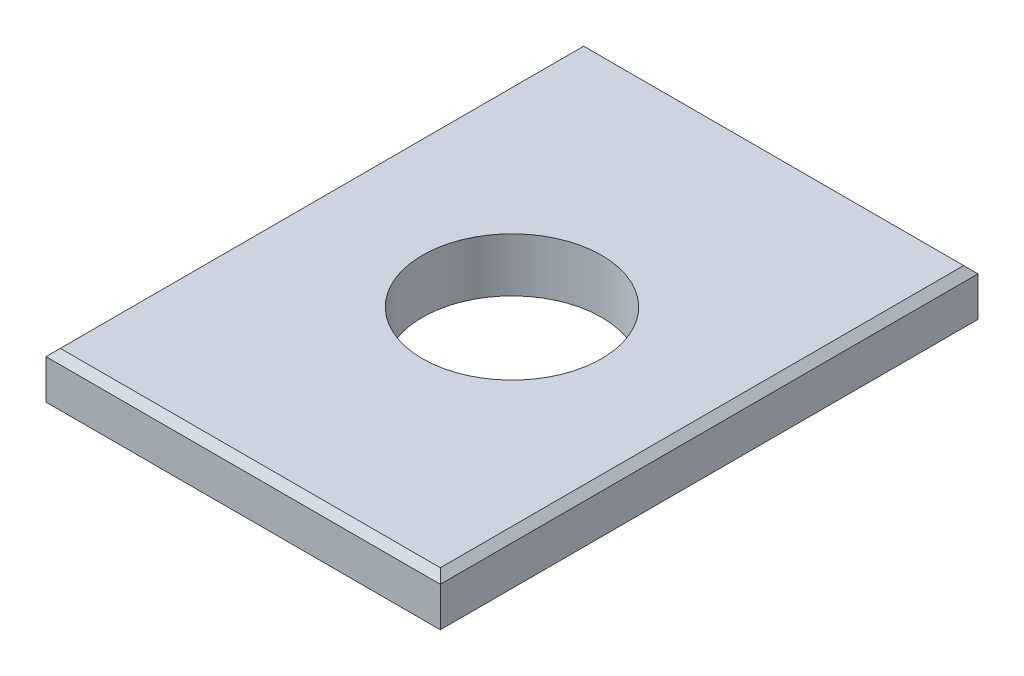
ISO-10303-21;
HEADER;
FILE_DESCRIPTION(('STEP AP214'),'2;1');
FILE_NAME('part.step','',(''),(''),'','','');
FILE_SCHEMA(('AUTOMOTIVE_DESIGN { 1 0 10303 214 1 1 1 1 }'));
ENDSEC;
DATA;
#1=APPLICATION_CONTEXT('core data for automotive mechanical design processes');
#2=APPLICATION_PROTOCOL_DEFINITION('international standard','automotive_design',2000,#1);
#3=PRODUCT_CONTEXT('',#1,'mechanical');
#4=PRODUCT('Part','Part','',(#3));
#5=PRODUCT_RELATED_PRODUCT_CATEGORY('part','',(#4));
#6=PRODUCT_DEFINITION_FORMATION('','',#4);
#7=PRODUCT_DEFINITION_CONTEXT('part definition',#1,'design');
#8=PRODUCT_DEFINITION('design','',#6,#7);
#9=PRODUCT_DEFINITION_SHAPE('','',#8);
#10=(LENGTH_UNIT() NAMED_UNIT(*) SI_UNIT(.MILLI.,.METRE.));
#11=(NAMED_UNIT(*) PLANE_ANGLE_UNIT() SI_UNIT($,.RADIAN.));
#12=(NAMED_UNIT(*) SI_UNIT($,.STERADIAN.) SOLID_ANGLE_UNIT());
#13=UNCERTAINTY_MEASURE_WITH_UNIT(LENGTH_MEASURE(1.E-05),#10,'distance_accuracy_value','');
#14=(GEOMETRIC_REPRESENTATION_CONTEXT(3) GLOBAL_UNCERTAINTY_ASSIGNED_CONTEXT((#13)) GLOBAL_UNIT_ASSIGNED_CONTEXT((#10,
#11,#12)) REPRESENTATION_CONTEXT('',''));
#15=CARTESIAN_POINT('',(0.,0.,0.));
#16=DIRECTION('',(0.,0.,1.));
#17=DIRECTION('',(1.,0.,0.));
#18=AXIS2_PLACEMENT_3D('',#15,#16,#17);
#19=CARTESIAN_POINT('',(5.49999999999962,1.50000000000022,-7.50000000000011));
#20=DIRECTION('',(-0.999999999999998,0.,0.));
#21=DIRECTION('',(0.,0.,1.));
#22=AXIS2_PLACEMENT_3D('',#19,#20,#21);
#23=PLANE('',#22);
#24=DIRECTION('',(0.,-0.999999999999995,0.));
#25=VECTOR('',#24,1.);
#26=CARTESIAN_POINT('',(5.49999999999934,1.50000000000022,7.49999999999917));
#27=LINE('',#26,#25);
#28=CARTESIAN_POINT('',(5.49999999999995,1.30000000000025,7.49999999999917));
#29=VERTEX_POINT('',#28);
#30=CARTESIAN_POINT('',(5.49999999999973,0.2000000000002,7.49999999999906));
#31=VERTEX_POINT('',#30);
#32=EDGE_CURVE('E191',#29,#31,#27,.T.);
#33=ORIENTED_EDGE('',*,*,#32,.T.);
#34=DIRECTION('',(0.,0.,-1.));
#35=VECTOR('',#34,1.);
#36=CARTESIAN_POINT('',(5.49999999999978,0.2000000000002,-7.50000000000012));
#37=LINE('',#36,#35);
#38=CARTESIAN_POINT('',(5.49999999999978,0.2000000000002,-7.50000000000012));
#39=VERTEX_POINT('',#38);
#40=EDGE_CURVE('E59',#31,#39,#37,.T.);
#41=ORIENTED_EDGE('',*,*,#40,.T.);
#42=DIRECTION('',(0.,-0.999999999999995,0.));
#43=VECTOR('',#42,1.);
#44=CARTESIAN_POINT('',(5.49999999999962,1.50000000000022,-7.50000000000011));
#45=LINE('',#44,#43);
#46=CARTESIAN_POINT('',(5.50000000000024,1.30000000000025,-7.50000000000012));
#47=VERTEX_POINT('',#46);
#48=EDGE_CURVE('E123',#47,#39,#45,.T.);
#49=ORIENTED_EDGE('',*,*,#48,.F.);
#50=DIRECTION('',(0.,0.,1.));
#51=VECTOR('',#50,1.);
#52=CARTESIAN_POINT('',(5.49999999999995,1.30000000000025,7.49999999999917));
#53=LINE('',#52,#51);
#54=EDGE_CURVE('E131',#47,#29,#53,.T.);
#55=ORIENTED_EDGE('',*,*,#54,.T.);
#56=EDGE_LOOP('',(#33,#41,#49,#55));
#57=FACE_BOUND('',#56,.T.);
#58=ADVANCED_FACE('F35',(#57),#23,.F.);
#59=CARTESIAN_POINT('',(-5.50000000000039,1.49999999999984,-7.49999999999989));
#60=DIRECTION('',(0.,0.,1.));
#61=DIRECTION('',(0.999999999999998,0.,0.));
#62=AXIS2_PLACEMENT_3D('',#59,#60,#61);
#63=PLANE('',#62);
#64=ORIENTED_EDGE('',*,*,#48,.T.);
#65=DIRECTION('',(-0.999999999999998,0.,0.));
#66=VECTOR('',#65,1.);
#67=CARTESIAN_POINT('',(-5.50000000000005,0.199999999999818,-7.4999999999999));
#68=LINE('',#67,#66);
#69=CARTESIAN_POINT('',(-5.50000000000005,0.199999999999818,-7.4999999999999));
#70=VERTEX_POINT('',#69);
#71=EDGE_CURVE('E44',#39,#70,#68,.T.);
#72=ORIENTED_EDGE('',*,*,#71,.T.);
#73=DIRECTION('',(0.,-0.999999999999995,0.));
#74=VECTOR('',#73,1.);
#75=CARTESIAN_POINT('',(-5.50000000000039,1.49999999999984,-7.49999999999989));
#76=LINE('',#75,#74);
#77=CARTESIAN_POINT('',(-5.49999999999977,1.29999999999986,-7.4999999999999));
#78=VERTEX_POINT('',#77);
#79=EDGE_CURVE('E198',#78,#70,#76,.T.);
#80=ORIENTED_EDGE('',*,*,#79,.F.);
#81=DIRECTION('',(0.999999999999998,0.,0.));
#82=VECTOR('',#81,1.);
#83=CARTESIAN_POINT('',(5.50000000000024,1.30000000000025,-7.50000000000012));
#84=LINE('',#83,#82);
#85=EDGE_CURVE('E110',#78,#47,#84,.T.);
#86=ORIENTED_EDGE('',*,*,#85,.T.);
#87=EDGE_LOOP('',(#64,#72,#80,#86));
#88=FACE_BOUND('',#87,.T.);
#89=ADVANCED_FACE('F210',(#88),#63,.F.);
#90=CARTESIAN_POINT('',(-5.50000000000039,1.49999999999984,-7.49999999999989));
#91=DIRECTION('',(0.999999999999998,0.,0.));
#92=DIRECTION('',(0.,0.,-1.));
#93=AXIS2_PLACEMENT_3D('',#90,#91,#92);
#94=PLANE('',#93);
#95=ORIENTED_EDGE('',*,*,#79,.T.);
#96=DIRECTION('',(0.,0.,1.));
#97=VECTOR('',#96,1.);
#98=CARTESIAN_POINT('',(-5.50000000000005,0.199999999999818,-7.4999999999999));
#99=LINE('',#98,#97);
#100=CARTESIAN_POINT('',(-5.50000000000023,0.199999999999874,7.49999999999935));
#101=VERTEX_POINT('',#100);
#102=EDGE_CURVE('E11',#70,#101,#99,.T.);
#103=ORIENTED_EDGE('',*,*,#102,.T.);
#104=DIRECTION('',(0.,-0.999999999999995,0.));
#105=VECTOR('',#104,1.);
#106=CARTESIAN_POINT('',(-5.50000000000062,1.49999999999984,7.49999999999935));
#107=LINE('',#106,#105);
#108=CARTESIAN_POINT('',(-5.50000000000001,1.29999999999986,7.49999999999935));
#109=VERTEX_POINT('',#108);
#110=EDGE_CURVE('E194',#109,#101,#107,.T.);
#111=ORIENTED_EDGE('',*,*,#110,.F.);
#112=DIRECTION('',(0.,0.,-1.));
#113=VECTOR('',#112,1.);
#114=CARTESIAN_POINT('',(-5.49999999999977,1.29999999999986,-7.4999999999999));
#115=LINE('',#114,#113);
#116=EDGE_CURVE('E139',#109,#78,#115,.T.);
#117=ORIENTED_EDGE('',*,*,#116,.T.);
#118=EDGE_LOOP('',(#95,#103,#111,#117));
#119=FACE_BOUND('',#118,.T.);
#120=ADVANCED_FACE('F212',(#119),#94,.F.);
#121=CARTESIAN_POINT('',(-5.50000000000062,1.49999999999984,7.49999999999935));
#122=DIRECTION('',(0.,0.,-1.));
#123=DIRECTION('',(-0.999999999999998,0.,0.));
#124=AXIS2_PLACEMENT_3D('',#121,#122,#123);
#125=PLANE('',#124);
#126=ORIENTED_EDGE('',*,*,#110,.T.);
#127=DIRECTION('',(0.999999999999998,0.,0.));
#128=VECTOR('',#127,1.);
#129=CARTESIAN_POINT('',(-5.50000000000023,0.199999999999874,7.49999999999935));
#130=LINE('',#129,#128);
#131=EDGE_CURVE('E140',#101,#31,#130,.T.);
#132=ORIENTED_EDGE('',*,*,#131,.T.);
#133=ORIENTED_EDGE('',*,*,#32,.F.);
#134=DIRECTION('',(-0.999999999999998,0.,0.));
#135=VECTOR('',#134,1.);
#136=CARTESIAN_POINT('',(-5.50000000000001,1.29999999999986,7.49999999999935));
#137=LINE('',#136,#135);
#138=EDGE_CURVE('E137',#29,#109,#137,.T.);
#139=ORIENTED_EDGE('',*,*,#138,.T.);
#140=EDGE_LOOP('',(#126,#132,#133,#139));
#141=FACE_BOUND('',#140,.T.);
#142=ADVANCED_FACE('F190',(#141),#125,.F.);
#143=CARTESIAN_POINT('',(-6.10622663543836E-13,1.5,0.));
#144=DIRECTION('',(0.,0.999999999999995,0.));
#145=DIRECTION('',(0.,0.,1.));
#146=AXIS2_PLACEMENT_3D('',#143,#144,#145);
#147=PLANE('',#146);
#148=DIRECTION('',(0.,0.,-1.));
#149=VECTOR('',#148,1.);
#150=CARTESIAN_POINT('',(5.29999999999964,1.5,-7.49999999999995));
#151=LINE('',#150,#149);
#152=CARTESIAN_POINT('',(5.29999999999942,1.50000000000023,7.2999999999992));
#153=VERTEX_POINT('',#152);
#154=CARTESIAN_POINT('',(5.29999999999936,1.5,-7.29999999999997));
#155=VERTEX_POINT('',#154);
#156=EDGE_CURVE('E128',#153,#155,#151,.T.);
#157=ORIENTED_EDGE('',*,*,#156,.T.);
#158=DIRECTION('',(-0.999999999999998,0.,0.));
#159=VECTOR('',#158,1.);
#160=CARTESIAN_POINT('',(-5.50000000000062,1.49999999999984,-7.29999999999991));
#161=LINE('',#160,#159);
#162=CARTESIAN_POINT('',(-5.30000000000058,1.50000000000029,-7.30000000000003));
#163=VERTEX_POINT('',#162);
#164=EDGE_CURVE('E108',#155,#163,#161,.T.);
#165=ORIENTED_EDGE('',*,*,#164,.T.);
#166=DIRECTION('',(0.,0.,1.));
#167=VECTOR('',#166,1.);
#168=CARTESIAN_POINT('',(-5.30000000000058,1.49999999999995,7.49999999999918));
#169=LINE('',#168,#167);
#170=CARTESIAN_POINT('',(-5.30000000000058,1.49999999999996,7.2999999999992));
#171=VERTEX_POINT('',#170);
#172=EDGE_CURVE('E116',#163,#171,#169,.T.);
#173=ORIENTED_EDGE('',*,*,#172,.T.);
#174=DIRECTION('',(0.999999999999998,0.,0.));
#175=VECTOR('',#174,1.);
#176=CARTESIAN_POINT('',(5.49999999999939,1.50000000000022,7.2999999999992));
#177=LINE('',#176,#175);
#178=EDGE_CURVE('E122',#171,#153,#177,.T.);
#179=ORIENTED_EDGE('',*,*,#178,.T.);
#180=EDGE_LOOP('',(#157,#165,#173,#179));
#181=FACE_BOUND('',#180,.T.);
#182=CARTESIAN_POINT('',(-6.10622663543836E-13,1.5,0.));
#183=DIRECTION('',(0.,0.999999999999995,0.));
#184=DIRECTION('',(0.,0.,1.));
#185=AXIS2_PLACEMENT_3D('',#182,#183,#184);
#186=CIRCLE('',#185,2.5);
#187=CARTESIAN_POINT('',(0.,1.50000000000001,2.5));
#188=VERTEX_POINT('',#187);
#189=EDGE_CURVE('E147',#188,#188,#186,.T.);
#190=ORIENTED_EDGE('',*,*,#189,.F.);
#191=EDGE_LOOP('',(#190));
#192=FACE_BOUND('',#191,.T.);
#193=ADVANCED_FACE('F125',(#181,#192),#147,.T.);
#194=CARTESIAN_POINT('',(0.,0.,0.));
#195=DIRECTION('',(0.,0.999999999999995,0.));
#196=DIRECTION('',(0.,0.,1.));
#197=AXIS2_PLACEMENT_3D('',#194,#195,#196);
#198=PLANE('',#197);
#199=DIRECTION('',(0.,0.,1.));
#200=VECTOR('',#199,1.);
#201=CARTESIAN_POINT('',(5.29999999999997,2.25514051876985E-13,0.));
#202=LINE('',#201,#200);
#203=CARTESIAN_POINT('',(5.29999999999975,2.22044604925031E-13,-7.29999999999981));
#204=VERTEX_POINT('',#203);
#205=CARTESIAN_POINT('',(5.29999999999981,2.25514051876985E-13,7.2999999999992));
#206=VERTEX_POINT('',#205);
#207=EDGE_CURVE('E154',#204,#206,#202,.T.);
#208=ORIENTED_EDGE('',*,*,#207,.T.);
#209=DIRECTION('',(-0.999999999999998,0.,0.));
#210=VECTOR('',#209,1.);
#211=CARTESIAN_POINT('',(-2.22044604925031E-13,1.66533453693773E-13,7.29999999999936));
#212=LINE('',#211,#210);
#213=CARTESIAN_POINT('',(-5.30000000000019,0.,7.2999999999992));
#214=VERTEX_POINT('',#213);
#215=EDGE_CURVE('E156',#206,#214,#212,.T.);
#216=ORIENTED_EDGE('',*,*,#215,.T.);
#217=DIRECTION('',(0.,0.,-1.));
#218=VECTOR('',#217,1.);
#219=CARTESIAN_POINT('',(-5.29999999999997,-1.59594559789866E-13,0.));
#220=LINE('',#219,#218);
#221=CARTESIAN_POINT('',(-5.30000000000019,2.84494650060196E-13,-7.30000000000003));
#222=VERTEX_POINT('',#221);
#223=EDGE_CURVE('E150',#214,#222,#220,.T.);
#224=ORIENTED_EDGE('',*,*,#223,.T.);
#225=DIRECTION('',(0.999999999999998,0.,0.));
#226=VECTOR('',#225,1.);
#227=CARTESIAN_POINT('',(-2.22044604925031E-13,0.,-7.29999999999992));
#228=LINE('',#227,#226);
#229=EDGE_CURVE('E152',#222,#204,#228,.T.);
#230=ORIENTED_EDGE('',*,*,#229,.T.);
#231=EDGE_LOOP('',(#208,#216,#224,#230));
#232=FACE_BOUND('',#231,.T.);
#233=CARTESIAN_POINT('',(0.,0.,0.));
#234=DIRECTION('',(0.,0.999999999999995,0.));
#235=DIRECTION('',(0.,0.,1.));
#236=AXIS2_PLACEMENT_3D('',#233,#234,#235);
#237=CIRCLE('',#236,2.5);
#238=CARTESIAN_POINT('',(0.,0.,2.5));
#239=VERTEX_POINT('',#238);
#240=EDGE_CURVE('E196',#239,#239,#237,.T.);
#241=ORIENTED_EDGE('',*,*,#240,.T.);
#242=EDGE_LOOP('',(#241));
#243=FACE_BOUND('',#242,.T.);
#244=ADVANCED_FACE('F179',(#232,#243),#198,.F.);
#245=CARTESIAN_POINT('',(0.,0.,0.));
#246=DIRECTION('',(0.,0.999999999999995,0.));
#247=DIRECTION('',(0.,0.,1.));
#248=AXIS2_PLACEMENT_3D('',#245,#246,#247);
#249=CYLINDRICAL_SURFACE('',#248,2.5);
#250=CARTESIAN_POINT('',(0.,0.,2.5));
#251=CARTESIAN_POINT('',(0.,0.0156250000000046,2.5));
#252=CARTESIAN_POINT('',(0.,0.0312500000000046,2.5));
#253=CARTESIAN_POINT('',(0.,0.0625000000000046,2.5));
#254=CARTESIAN_POINT('',(0.,0.0781250000000047,2.5));
#255=CARTESIAN_POINT('',(0.,0.109375000000005,2.5));
#256=CARTESIAN_POINT('',(0.,0.125000000000005,2.5));
#257=CARTESIAN_POINT('',(0.,0.156250000000005,2.5));
#258=CARTESIAN_POINT('',(0.,0.171875000000005,2.5));
#259=CARTESIAN_POINT('',(0.,0.203125000000005,2.5));
#260=CARTESIAN_POINT('',(0.,0.218750000000005,2.5));
#261=CARTESIAN_POINT('',(0.,0.250000000000005,2.5));
#262=CARTESIAN_POINT('',(0.,0.265625000000005,2.5));
#263=CARTESIAN_POINT('',(0.,0.296875000000005,2.5));
#264=CARTESIAN_POINT('',(0.,0.312500000000005,2.5));
#265=CARTESIAN_POINT('',(0.,0.343750000000005,2.5));
#266=CARTESIAN_POINT('',(0.,0.359375000000005,2.5));
#267=CARTESIAN_POINT('',(0.,0.390625000000005,2.5));
#268=CARTESIAN_POINT('',(0.,0.406250000000005,2.5));
#269=CARTESIAN_POINT('',(0.,0.437500000000005,2.5));
#270=CARTESIAN_POINT('',(0.,0.453125000000005,2.5));
#271=CARTESIAN_POINT('',(0.,0.484375000000005,2.5));
#272=CARTESIAN_POINT('',(0.,0.500000000000005,2.5));
#273=CARTESIAN_POINT('',(0.,0.531250000000005,2.5));
#274=CARTESIAN_POINT('',(0.,0.546875000000005,2.5));
#275=CARTESIAN_POINT('',(0.,0.578125000000005,2.5));
#276=CARTESIAN_POINT('',(0.,0.593750000000005,2.5));
#277=CARTESIAN_POINT('',(0.,0.625000000000005,2.5));
#278=CARTESIAN_POINT('',(0.,0.640625000000005,2.5));
#279=CARTESIAN_POINT('',(0.,0.671875000000005,2.5));
#280=CARTESIAN_POINT('',(0.,0.687500000000005,2.5));
#281=CARTESIAN_POINT('',(0.,0.718750000000005,2.5));
#282=CARTESIAN_POINT('',(0.,0.734375000000005,2.5));
#283=CARTESIAN_POINT('',(0.,0.765625000000005,2.5));
#284=CARTESIAN_POINT('',(0.,0.781250000000005,2.5));
#285=CARTESIAN_POINT('',(0.,0.812500000000005,2.5));
#286=CARTESIAN_POINT('',(0.,0.828125000000005,2.5));
#287=CARTESIAN_POINT('',(0.,0.859375000000005,2.5));
#288=CARTESIAN_POINT('',(0.,0.875000000000005,2.5));
#289=CARTESIAN_POINT('',(0.,0.906250000000005,2.5));
#290=CARTESIAN_POINT('',(0.,0.921875000000005,2.5));
#291=CARTESIAN_POINT('',(0.,0.953125000000006,2.5));
#292=CARTESIAN_POINT('',(0.,0.968750000000005,2.5));
#293=CARTESIAN_POINT('',(0.,1.00000000000001,2.5));
#294=CARTESIAN_POINT('',(0.,1.01562500000001,2.5));
#295=CARTESIAN_POINT('',(0.,1.04687500000001,2.5));
#296=CARTESIAN_POINT('',(0.,1.06250000000001,2.5));
#297=CARTESIAN_POINT('',(0.,1.09375000000001,2.5));
#298=CARTESIAN_POINT('',(0.,1.10937500000001,2.5));
#299=CARTESIAN_POINT('',(0.,1.14062500000001,2.5));
#300=CARTESIAN_POINT('',(0.,1.15625000000001,2.5));
#301=CARTESIAN_POINT('',(0.,1.18750000000001,2.5));
#302=CARTESIAN_POINT('',(0.,1.20312500000001,2.5));
#303=CARTESIAN_POINT('',(0.,1.23437500000001,2.5));
#304=CARTESIAN_POINT('',(0.,1.25000000000001,2.5));
#305=CARTESIAN_POINT('',(0.,1.28125000000001,2.5));
#306=CARTESIAN_POINT('',(0.,1.29687500000001,2.5));
#307=CARTESIAN_POINT('',(0.,1.32812500000001,2.5));
#308=CARTESIAN_POINT('',(0.,1.34375000000001,2.5));
#309=CARTESIAN_POINT('',(0.,1.37500000000001,2.5));
#310=CARTESIAN_POINT('',(0.,1.39062500000001,2.5));
#311=CARTESIAN_POINT('',(0.,1.42187500000001,2.5));
#312=CARTESIAN_POINT('',(0.,1.43750000000001,2.5));
#313=CARTESIAN_POINT('',(0.,1.46875000000001,2.5));
#314=CARTESIAN_POINT('',(0.,1.48437500000001,2.5));
#315=CARTESIAN_POINT('',(0.,1.50000000000001,2.5));
#316=B_SPLINE_CURVE_WITH_KNOTS('',3,(#250,#251,#252,#253,#254,#255,#256,#257,#258,#259,#260,
#261,#262,#263,#264,#265,#266,#267,#268,#269,#270,#271,#272,#273,#274,#275,#276,#277,#278,#279,
#280,#281,#282,#283,#284,#285,#286,#287,#288,#289,#290,#291,#292,#293,#294,#295,#296,#297,#298,
#299,#300,#301,#302,#303,#304,#305,#306,#307,#308,#309,#310,#311,#312,#313,#314,#315),
.UNSPECIFIED.,.F.,.F.,(4,2,2,2,2,2,2,2,2,2,2,2,2,2,2,2,2,2,2,2,2,2,2,2,2,2,2,2,2,2,2,2,4),(0.,
0.046875,0.0937500000000001,0.140625,0.1875,0.234375,0.28125,0.328125,0.375,0.421875,0.46875,
0.515625,0.562500000000001,0.609375000000001,0.656250000000001,0.703125000000001,
0.750000000000001,0.796875000000001,0.843750000000001,0.890625000000001,0.937500000000001,
0.984375000000001,1.03125,1.078125,1.125,1.171875,1.21875,1.265625,1.3125,1.359375,1.40625,
1.453125,1.5),.UNSPECIFIED.);
#317=EDGE_CURVE('BSEAM234',#239,#188,#316,.T.);
#318=ORIENTED_EDGE('',*,*,#240,.F.);
#319=ORIENTED_EDGE('',*,*,#189,.T.);
#320=ORIENTED_EDGE('',*,*,#317,.T.);
#321=ORIENTED_EDGE('',*,*,#317,.F.);
#322=EDGE_LOOP('',(#318,#320,#319,#321));
#323=FACE_BOUND('',#322,.T.);
#324=ADVANCED_FACE('F234',(#323),#249,.F.);
#325=CARTESIAN_POINT('',(-6.10622663543836E-13,1.50000000000017,7.29999999999936));
#326=DIRECTION('',(0.,0.707106781186538,0.70710678118655));
#327=DIRECTION('',(-0.999999999999998,0.,0.));
#328=AXIS2_PLACEMENT_3D('',#325,#326,#327);
#329=PLANE('',#328);
#330=DIRECTION('',(0.577350269189618,0.577350269189625,-0.577350269189623));
#331=VECTOR('',#330,1.);
#332=CARTESIAN_POINT('',(-2.86666666666668,3.93333333333328,4.86666666666592));
#333=LINE('',#332,#331);
#334=EDGE_CURVE('E119',#109,#171,#333,.T.);
#335=ORIENTED_EDGE('',*,*,#334,.F.);
#336=ORIENTED_EDGE('',*,*,#138,.F.);
#337=DIRECTION('',(-0.577350269189622,0.577350269189626,-0.577350269189628));
#338=VECTOR('',#337,1.);
#339=CARTESIAN_POINT('',(3.53333333333322,3.26666666666735,5.53333333333245));
#340=LINE('',#339,#338);
#341=EDGE_CURVE('E144',#153,#29,#340,.F.);
#342=ORIENTED_EDGE('',*,*,#341,.F.);
#343=ORIENTED_EDGE('',*,*,#178,.F.);
#344=EDGE_LOOP('',(#335,#336,#342,#343));
#345=FACE_BOUND('',#344,.T.);
#346=ADVANCED_FACE('F207',(#345),#329,.T.);
#347=CARTESIAN_POINT('',(5.29999999999936,1.5,0.));
#348=DIRECTION('',(0.707106781186547,0.707106781186537,0.));
#349=DIRECTION('',(0.,0.,1.));
#350=AXIS2_PLACEMENT_3D('',#347,#348,#349);
#351=PLANE('',#350);
#352=ORIENTED_EDGE('',*,*,#341,.T.);
#353=ORIENTED_EDGE('',*,*,#54,.F.);
#354=DIRECTION('',(-0.577350269189618,0.577350269189623,0.577350269189622));
#355=VECTOR('',#354,1.);
#356=CARTESIAN_POINT('',(2.86666666666628,3.93333333333356,-4.86666666666691));
#357=LINE('',#356,#355);
#358=EDGE_CURVE('E113',#155,#47,#357,.F.);
#359=ORIENTED_EDGE('',*,*,#358,.F.);
#360=ORIENTED_EDGE('',*,*,#156,.F.);
#361=EDGE_LOOP('',(#352,#353,#359,#360));
#362=FACE_BOUND('',#361,.T.);
#363=ADVANCED_FACE('F209',(#362),#351,.T.);
#364=CARTESIAN_POINT('',(-5.30000000000058,1.49999999999984,0.));
#365=DIRECTION('',(-0.707106781186548,0.707106781186539,0.));
#366=DIRECTION('',(0.,0.,-1.));
#367=AXIS2_PLACEMENT_3D('',#364,#365,#366);
#368=PLANE('',#367);
#369=ORIENTED_EDGE('',*,*,#334,.T.);
#370=ORIENTED_EDGE('',*,*,#172,.F.);
#371=DIRECTION('',(-0.577350269189622,-0.577350269189621,-0.577350269189626));
#372=VECTOR('',#371,1.);
#373=CARTESIAN_POINT('',(-2.86666666666691,3.93333333333289,-4.86666666666685));
#374=LINE('',#373,#372);
#375=EDGE_CURVE('E104',#78,#163,#374,.F.);
#376=ORIENTED_EDGE('',*,*,#375,.F.);
#377=ORIENTED_EDGE('',*,*,#116,.F.);
#378=EDGE_LOOP('',(#369,#370,#376,#377));
#379=FACE_BOUND('',#378,.T.);
#380=ADVANCED_FACE('F117',(#379),#368,.T.);
#381=CARTESIAN_POINT('',(-6.10622663543836E-13,1.5,-7.30000000000003));
#382=DIRECTION('',(0.,0.70710678118654,-0.707106781186552));
#383=DIRECTION('',(0.999999999999998,0.,0.));
#384=AXIS2_PLACEMENT_3D('',#381,#382,#383);
#385=PLANE('',#384);
#386=ORIENTED_EDGE('',*,*,#358,.T.);
#387=ORIENTED_EDGE('',*,*,#85,.F.);
#388=ORIENTED_EDGE('',*,*,#375,.T.);
#389=ORIENTED_EDGE('',*,*,#164,.F.);
#390=EDGE_LOOP('',(#386,#387,#388,#389));
#391=FACE_BOUND('',#390,.T.);
#392=ADVANCED_FACE('F106',(#391),#385,.T.);
#393=CARTESIAN_POINT('',(-5.50000000000005,0.199999999999818,-7.4999999999999));
#394=DIRECTION('',(0.,0.707106781186544,0.707106781186544));
#395=DIRECTION('',(-0.999999999999998,0.,0.));
#396=AXIS2_PLACEMENT_3D('',#393,#394,#395);
#397=PLANE('',#396);
#398=DIRECTION('',(-0.57735026918962,-0.577350269189618,0.577350269189626));
#399=VECTOR('',#398,1.);
#400=CARTESIAN_POINT('',(1.83333333333292,-3.46666666666645,-3.83333333333347));
#401=LINE('',#400,#399);
#402=EDGE_CURVE('E164',#204,#39,#401,.F.);
#403=ORIENTED_EDGE('',*,*,#402,.F.);
#404=ORIENTED_EDGE('',*,*,#229,.F.);
#405=DIRECTION('',(0.577350269189626,-0.577350269189619,0.577350269189631));
#406=VECTOR('',#405,1.);
#407=CARTESIAN_POINT('',(-5.50000000000005,0.199999999999818,-7.4999999999999));
#408=LINE('',#407,#406);
#409=EDGE_CURVE('E39',#70,#222,#408,.T.);
#410=ORIENTED_EDGE('',*,*,#409,.F.);
#411=ORIENTED_EDGE('',*,*,#71,.F.);
#412=EDGE_LOOP('',(#403,#404,#410,#411));
#413=FACE_BOUND('',#412,.T.);
#414=ADVANCED_FACE('F37',(#413),#397,.F.);
#415=CARTESIAN_POINT('',(-5.50000000000005,0.199999999999818,-7.4999999999999));
#416=DIRECTION('',(0.70710678118654,0.707106781186544,0.));
#417=DIRECTION('',(0.,0.,1.));
#418=AXIS2_PLACEMENT_3D('',#415,#416,#417);
#419=PLANE('',#418);
#420=ORIENTED_EDGE('',*,*,#409,.T.);
#421=ORIENTED_EDGE('',*,*,#223,.F.);
#422=DIRECTION('',(-0.577350269189622,0.577350269189616,0.577350269189625));
#423=VECTOR('',#422,1.);
#424=CARTESIAN_POINT('',(-0.499999999999987,-4.80000000000019,2.49999999999956));
#425=LINE('',#424,#423);
#426=EDGE_CURVE('E163',#101,#214,#425,.F.);
#427=ORIENTED_EDGE('',*,*,#426,.F.);
#428=ORIENTED_EDGE('',*,*,#102,.F.);
#429=EDGE_LOOP('',(#420,#421,#427,#428));
#430=FACE_BOUND('',#429,.T.);
#431=ADVANCED_FACE('F174',(#430),#419,.F.);
#432=CARTESIAN_POINT('',(5.49999999999978,0.2000000000002,-7.50000000000012));
#433=DIRECTION('',(-0.707106781186542,0.707106781186545,0.));
#434=DIRECTION('',(0.,0.,-1.));
#435=AXIS2_PLACEMENT_3D('',#432,#433,#434);
#436=PLANE('',#435);
#437=ORIENTED_EDGE('',*,*,#402,.T.);
#438=ORIENTED_EDGE('',*,*,#40,.F.);
#439=DIRECTION('',(-0.577350269189624,-0.577350269189615,-0.57735026918963));
#440=VECTOR('',#439,1.);
#441=CARTESIAN_POINT('',(0.499999999999903,-4.79999999999968,2.49999999999972));
#442=LINE('',#441,#440);
#443=EDGE_CURVE('E161',#206,#31,#442,.F.);
#444=ORIENTED_EDGE('',*,*,#443,.F.);
#445=ORIENTED_EDGE('',*,*,#207,.F.);
#446=EDGE_LOOP('',(#437,#438,#444,#445));
#447=FACE_BOUND('',#446,.T.);
#448=ADVANCED_FACE('F186',(#447),#436,.F.);
#449=CARTESIAN_POINT('',(-5.50000000000023,0.199999999999874,7.49999999999935));
#450=DIRECTION('',(0.,0.707106781186546,-0.707106781186546));
#451=DIRECTION('',(0.999999999999998,0.,0.));
#452=AXIS2_PLACEMENT_3D('',#449,#450,#451);
#453=PLANE('',#452);
#454=ORIENTED_EDGE('',*,*,#426,.T.);
#455=ORIENTED_EDGE('',*,*,#215,.F.);
#456=ORIENTED_EDGE('',*,*,#443,.T.);
#457=ORIENTED_EDGE('',*,*,#131,.F.);
#458=EDGE_LOOP('',(#454,#455,#456,#457));
#459=FACE_BOUND('',#458,.T.);
#460=ADVANCED_FACE('F184',(#459),#453,.F.);
#461=CLOSED_SHELL('',(#58,#89,#120,#142,#193,#244,#324,#346,#363,#380,#392,#414,#431,#448,#460));
#462=MANIFOLD_SOLID_BREP('B2',#461);
#463=ADVANCED_BREP_SHAPE_REPRESENTATION('',(#18,#462),#14);
#464=SHAPE_DEFINITION_REPRESENTATION(#9,#463);
ENDSEC;
END-ISO-10303-21;
